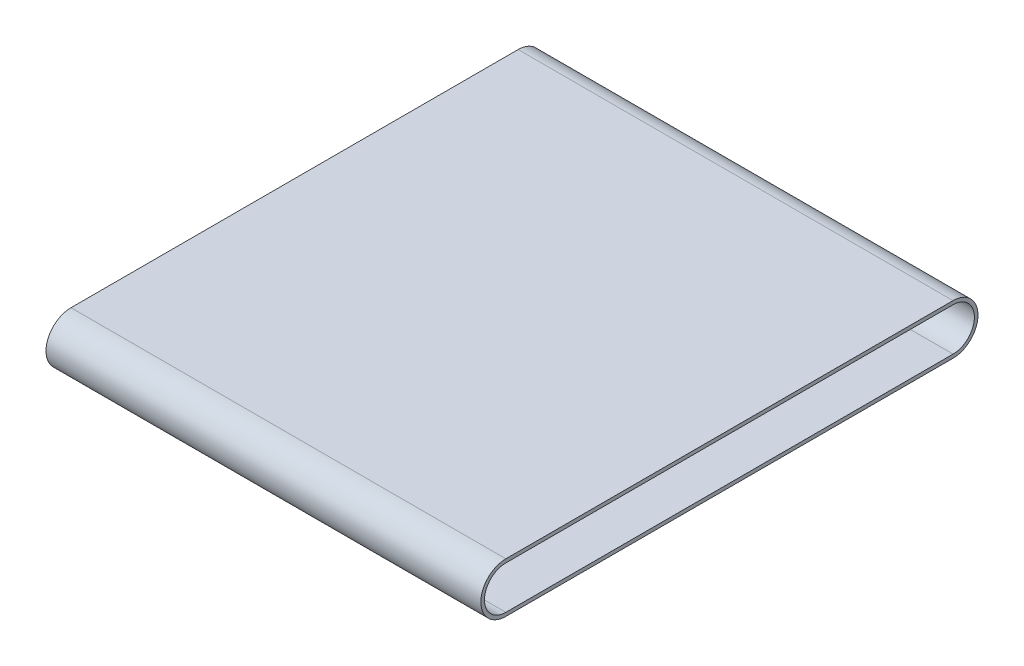
ISO-10303-21;
HEADER;
FILE_DESCRIPTION(('STEP AP214'),'2;1');
FILE_NAME('part.step','',(''),(''),'','','');
FILE_SCHEMA(('AUTOMOTIVE_DESIGN { 1 0 10303 214 1 1 1 1 }'));
ENDSEC;
DATA;
#1=APPLICATION_CONTEXT('core data for automotive mechanical design processes');
#2=APPLICATION_PROTOCOL_DEFINITION('international standard','automotive_design',2000,#1);
#3=PRODUCT_CONTEXT('',#1,'mechanical');
#4=PRODUCT('Part','Part','',(#3));
#5=PRODUCT_RELATED_PRODUCT_CATEGORY('part','',(#4));
#6=PRODUCT_DEFINITION_FORMATION('','',#4);
#7=PRODUCT_DEFINITION_CONTEXT('part definition',#1,'design');
#8=PRODUCT_DEFINITION('design','',#6,#7);
#9=PRODUCT_DEFINITION_SHAPE('','',#8);
#10=(LENGTH_UNIT() NAMED_UNIT(*) SI_UNIT(.MILLI.,.METRE.));
#11=(NAMED_UNIT(*) PLANE_ANGLE_UNIT() SI_UNIT($,.RADIAN.));
#12=(NAMED_UNIT(*) SI_UNIT($,.STERADIAN.) SOLID_ANGLE_UNIT());
#13=UNCERTAINTY_MEASURE_WITH_UNIT(LENGTH_MEASURE(1.E-05),#10,'distance_accuracy_value','');
#14=(GEOMETRIC_REPRESENTATION_CONTEXT(3) GLOBAL_UNCERTAINTY_ASSIGNED_CONTEXT((#13)) GLOBAL_UNIT_ASSIGNED_CONTEXT((#10,
#11,#12)) REPRESENTATION_CONTEXT('',''));
#15=CARTESIAN_POINT('',(0.,0.,0.));
#16=DIRECTION('',(0.,0.,1.));
#17=DIRECTION('',(1.,0.,0.));
#18=AXIS2_PLACEMENT_3D('',#15,#16,#17);
#19=CARTESIAN_POINT('',(444.5,0.,0.));
#20=DIRECTION('',(1.,0.,0.));
#21=DIRECTION('',(0.,0.,-1.));
#22=AXIS2_PLACEMENT_3D('',#19,#20,#21);
#23=PLANE('',#22);
#24=CARTESIAN_POINT('',(444.5,0.,0.));
#25=DIRECTION('',(1.,0.,0.));
#26=DIRECTION('',(0.,0.,-1.));
#27=AXIS2_PLACEMENT_3D('',#24,#25,#26);
#28=CIRCLE('',#27,25.527);
#29=CARTESIAN_POINT('',(444.5,25.527,0.));
#30=VERTEX_POINT('',#29);
#31=CARTESIAN_POINT('',(444.5,-25.527,0.));
#32=VERTEX_POINT('',#31);
#33=EDGE_CURVE('E151',#30,#32,#28,.T.);
#34=ORIENTED_EDGE('',*,*,#33,.T.);
#35=DIRECTION('',(0.,0.,-1.));
#36=VECTOR('',#35,1.);
#37=CARTESIAN_POINT('',(444.5,-25.527,0.));
#38=LINE('',#37,#36);
#39=CARTESIAN_POINT('',(444.5,-25.527,-457.073));
#40=VERTEX_POINT('',#39);
#41=EDGE_CURVE('E155',#32,#40,#38,.T.);
#42=ORIENTED_EDGE('',*,*,#41,.T.);
#43=CARTESIAN_POINT('',(444.5,0.,-457.073));
#44=DIRECTION('',(1.,0.,0.));
#45=DIRECTION('',(0.,0.,-1.));
#46=AXIS2_PLACEMENT_3D('',#43,#44,#45);
#47=CIRCLE('',#46,25.527);
#48=CARTESIAN_POINT('',(444.5,25.527,-457.073));
#49=VERTEX_POINT('',#48);
#50=EDGE_CURVE('E159',#40,#49,#47,.T.);
#51=ORIENTED_EDGE('',*,*,#50,.T.);
#52=DIRECTION('',(0.,0.,1.));
#53=VECTOR('',#52,1.);
#54=CARTESIAN_POINT('',(444.5,25.527,0.));
#55=LINE('',#54,#53);
#56=EDGE_CURVE('E162',#49,#30,#55,.T.);
#57=ORIENTED_EDGE('',*,*,#56,.T.);
#58=EDGE_LOOP('',(#34,#42,#51,#57));
#59=FACE_BOUND('',#58,.T.);
#60=DIRECTION('',(0.,0.,-1.));
#61=VECTOR('',#60,1.);
#62=CARTESIAN_POINT('',(444.5,-21.844,0.));
#63=LINE('',#62,#61);
#64=CARTESIAN_POINT('',(444.5,-21.844,0.));
#65=VERTEX_POINT('',#64);
#66=CARTESIAN_POINT('',(444.5,-21.844,-457.073));
#67=VERTEX_POINT('',#66);
#68=EDGE_CURVE('E111',#65,#67,#63,.T.);
#69=ORIENTED_EDGE('',*,*,#68,.F.);
#70=CARTESIAN_POINT('',(444.5,0.,0.));
#71=DIRECTION('',(1.,0.,0.));
#72=DIRECTION('',(0.,0.,-1.));
#73=AXIS2_PLACEMENT_3D('',#70,#71,#72);
#74=CIRCLE('',#73,21.844);
#75=CARTESIAN_POINT('',(444.5,21.844,0.));
#76=VERTEX_POINT('',#75);
#77=EDGE_CURVE('E102',#76,#65,#74,.T.);
#78=ORIENTED_EDGE('',*,*,#77,.F.);
#79=DIRECTION('',(0.,0.,1.));
#80=VECTOR('',#79,1.);
#81=CARTESIAN_POINT('',(444.5,21.844,0.));
#82=LINE('',#81,#80);
#83=CARTESIAN_POINT('',(444.5,21.844,-457.073));
#84=VERTEX_POINT('',#83);
#85=EDGE_CURVE('E129',#84,#76,#82,.T.);
#86=ORIENTED_EDGE('',*,*,#85,.F.);
#87=CARTESIAN_POINT('',(444.5,0.,-457.073));
#88=DIRECTION('',(1.,0.,0.));
#89=DIRECTION('',(0.,0.,-1.));
#90=AXIS2_PLACEMENT_3D('',#87,#88,#89);
#91=CIRCLE('',#90,21.844);
#92=EDGE_CURVE('E124',#67,#84,#91,.T.);
#93=ORIENTED_EDGE('',*,*,#92,.F.);
#94=EDGE_LOOP('',(#69,#78,#86,#93));
#95=FACE_BOUND('',#94,.T.);
#96=ADVANCED_FACE('F36',(#59,#95),#23,.T.);
#97=CARTESIAN_POINT('',(0.,0.,0.));
#98=DIRECTION('',(1.,0.,0.));
#99=DIRECTION('',(0.,0.,-1.));
#100=AXIS2_PLACEMENT_3D('',#97,#98,#99);
#101=PLANE('',#100);
#102=CARTESIAN_POINT('',(0.,0.,0.));
#103=DIRECTION('',(1.,0.,0.));
#104=DIRECTION('',(0.,0.,-1.));
#105=AXIS2_PLACEMENT_3D('',#102,#103,#104);
#106=CIRCLE('',#105,25.527);
#107=CARTESIAN_POINT('',(0.,25.527,0.));
#108=VERTEX_POINT('',#107);
#109=CARTESIAN_POINT('',(0.,-25.527,0.));
#110=VERTEX_POINT('',#109);
#111=EDGE_CURVE('E120',#108,#110,#106,.T.);
#112=ORIENTED_EDGE('',*,*,#111,.F.);
#113=DIRECTION('',(0.,0.,1.));
#114=VECTOR('',#113,1.);
#115=CARTESIAN_POINT('',(0.,25.527,0.));
#116=LINE('',#115,#114);
#117=CARTESIAN_POINT('',(0.,25.527,-457.073));
#118=VERTEX_POINT('',#117);
#119=EDGE_CURVE('E156',#118,#108,#116,.T.);
#120=ORIENTED_EDGE('',*,*,#119,.F.);
#121=CARTESIAN_POINT('',(0.,0.,-457.073));
#122=DIRECTION('',(1.,0.,0.));
#123=DIRECTION('',(0.,0.,-1.));
#124=AXIS2_PLACEMENT_3D('',#121,#122,#123);
#125=CIRCLE('',#124,25.527);
#126=CARTESIAN_POINT('',(0.,-25.527,-457.073));
#127=VERTEX_POINT('',#126);
#128=EDGE_CURVE('E172',#127,#118,#125,.T.);
#129=ORIENTED_EDGE('',*,*,#128,.F.);
#130=DIRECTION('',(0.,0.,-1.));
#131=VECTOR('',#130,1.);
#132=CARTESIAN_POINT('',(0.,-25.527,0.));
#133=LINE('',#132,#131);
#134=EDGE_CURVE('E169',#110,#127,#133,.T.);
#135=ORIENTED_EDGE('',*,*,#134,.F.);
#136=EDGE_LOOP('',(#112,#120,#129,#135));
#137=FACE_BOUND('',#136,.T.);
#138=CARTESIAN_POINT('',(0.,0.,0.));
#139=DIRECTION('',(1.,0.,0.));
#140=DIRECTION('',(0.,0.,-1.));
#141=AXIS2_PLACEMENT_3D('',#138,#139,#140);
#142=CIRCLE('',#141,21.844);
#143=CARTESIAN_POINT('',(0.,21.844,0.));
#144=VERTEX_POINT('',#143);
#145=CARTESIAN_POINT('',(0.,-21.844,0.));
#146=VERTEX_POINT('',#145);
#147=EDGE_CURVE('E60',#144,#146,#142,.T.);
#148=ORIENTED_EDGE('',*,*,#147,.T.);
#149=DIRECTION('',(0.,0.,-1.));
#150=VECTOR('',#149,1.);
#151=CARTESIAN_POINT('',(0.,-21.844,0.));
#152=LINE('',#151,#150);
#153=CARTESIAN_POINT('',(0.,-21.844,-457.073));
#154=VERTEX_POINT('',#153);
#155=EDGE_CURVE('E118',#146,#154,#152,.T.);
#156=ORIENTED_EDGE('',*,*,#155,.T.);
#157=CARTESIAN_POINT('',(0.,0.,-457.073));
#158=DIRECTION('',(1.,0.,0.));
#159=DIRECTION('',(0.,0.,-1.));
#160=AXIS2_PLACEMENT_3D('',#157,#158,#159);
#161=CIRCLE('',#160,21.844);
#162=CARTESIAN_POINT('',(0.,21.844,-457.073));
#163=VERTEX_POINT('',#162);
#164=EDGE_CURVE('E138',#154,#163,#161,.T.);
#165=ORIENTED_EDGE('',*,*,#164,.T.);
#166=DIRECTION('',(0.,0.,1.));
#167=VECTOR('',#166,1.);
#168=CARTESIAN_POINT('',(0.,21.844,0.));
#169=LINE('',#168,#167);
#170=EDGE_CURVE('E112',#163,#144,#169,.T.);
#171=ORIENTED_EDGE('',*,*,#170,.T.);
#172=EDGE_LOOP('',(#148,#156,#165,#171));
#173=FACE_BOUND('',#172,.T.);
#174=ADVANCED_FACE('F196',(#137,#173),#101,.F.);
#175=CARTESIAN_POINT('',(444.5,0.,0.));
#176=DIRECTION('',(-1.,0.,0.));
#177=DIRECTION('',(0.,0.,1.));
#178=AXIS2_PLACEMENT_3D('',#175,#176,#177);
#179=CYLINDRICAL_SURFACE('',#178,25.527);
#180=ORIENTED_EDGE('',*,*,#111,.T.);
#181=DIRECTION('',(-1.,0.,0.));
#182=VECTOR('',#181,1.);
#183=CARTESIAN_POINT('',(444.5,-25.527,0.));
#184=LINE('',#183,#182);
#185=EDGE_CURVE('E11',#32,#110,#184,.T.);
#186=ORIENTED_EDGE('',*,*,#185,.F.);
#187=ORIENTED_EDGE('',*,*,#33,.F.);
#188=DIRECTION('',(-1.,0.,0.));
#189=VECTOR('',#188,1.);
#190=CARTESIAN_POINT('',(444.5,25.527,0.));
#191=LINE('',#190,#189);
#192=EDGE_CURVE('E165',#30,#108,#191,.T.);
#193=ORIENTED_EDGE('',*,*,#192,.T.);
#194=EDGE_LOOP('',(#180,#186,#187,#193));
#195=FACE_BOUND('',#194,.T.);
#196=ADVANCED_FACE('F38',(#195),#179,.T.);
#197=CARTESIAN_POINT('',(444.5,-25.527,0.));
#198=DIRECTION('',(0.,1.,0.));
#199=DIRECTION('',(0.,0.,1.));
#200=AXIS2_PLACEMENT_3D('',#197,#198,#199);
#201=PLANE('',#200);
#202=ORIENTED_EDGE('',*,*,#134,.T.);
#203=DIRECTION('',(-1.,0.,0.));
#204=VECTOR('',#203,1.);
#205=CARTESIAN_POINT('',(444.5,-25.527,-457.073));
#206=LINE('',#205,#204);
#207=EDGE_CURVE('E45',#40,#127,#206,.T.);
#208=ORIENTED_EDGE('',*,*,#207,.F.);
#209=ORIENTED_EDGE('',*,*,#41,.F.);
#210=ORIENTED_EDGE('',*,*,#185,.T.);
#211=EDGE_LOOP('',(#202,#208,#209,#210));
#212=FACE_BOUND('',#211,.T.);
#213=ADVANCED_FACE('F206',(#212),#201,.F.);
#214=CARTESIAN_POINT('',(444.5,0.,-457.073));
#215=DIRECTION('',(-1.,0.,0.));
#216=DIRECTION('',(0.,0.,1.));
#217=AXIS2_PLACEMENT_3D('',#214,#215,#216);
#218=CYLINDRICAL_SURFACE('',#217,25.527);
#219=ORIENTED_EDGE('',*,*,#128,.T.);
#220=DIRECTION('',(-1.,0.,0.));
#221=VECTOR('',#220,1.);
#222=CARTESIAN_POINT('',(444.5,25.527,-457.073));
#223=LINE('',#222,#221);
#224=EDGE_CURVE('E180',#49,#118,#223,.T.);
#225=ORIENTED_EDGE('',*,*,#224,.F.);
#226=ORIENTED_EDGE('',*,*,#50,.F.);
#227=ORIENTED_EDGE('',*,*,#207,.T.);
#228=EDGE_LOOP('',(#219,#225,#226,#227));
#229=FACE_BOUND('',#228,.T.);
#230=ADVANCED_FACE('F190',(#229),#218,.T.);
#231=CARTESIAN_POINT('',(444.5,25.527,0.));
#232=DIRECTION('',(0.,-1.,0.));
#233=DIRECTION('',(0.,0.,-1.));
#234=AXIS2_PLACEMENT_3D('',#231,#232,#233);
#235=PLANE('',#234);
#236=ORIENTED_EDGE('',*,*,#119,.T.);
#237=ORIENTED_EDGE('',*,*,#192,.F.);
#238=ORIENTED_EDGE('',*,*,#56,.F.);
#239=ORIENTED_EDGE('',*,*,#224,.T.);
#240=EDGE_LOOP('',(#236,#237,#238,#239));
#241=FACE_BOUND('',#240,.T.);
#242=ADVANCED_FACE('F200',(#241),#235,.F.);
#243=CARTESIAN_POINT('',(444.5,0.,0.));
#244=DIRECTION('',(-1.,0.,0.));
#245=DIRECTION('',(0.,0.,1.));
#246=AXIS2_PLACEMENT_3D('',#243,#244,#245);
#247=CYLINDRICAL_SURFACE('',#246,21.844);
#248=ORIENTED_EDGE('',*,*,#147,.F.);
#249=DIRECTION('',(-1.,0.,0.));
#250=VECTOR('',#249,1.);
#251=CARTESIAN_POINT('',(444.5,21.844,0.));
#252=LINE('',#251,#250);
#253=EDGE_CURVE('E106',#76,#144,#252,.T.);
#254=ORIENTED_EDGE('',*,*,#253,.F.);
#255=ORIENTED_EDGE('',*,*,#77,.T.);
#256=DIRECTION('',(-1.,0.,0.));
#257=VECTOR('',#256,1.);
#258=CARTESIAN_POINT('',(444.5,-21.844,0.));
#259=LINE('',#258,#257);
#260=EDGE_CURVE('E105',#65,#146,#259,.T.);
#261=ORIENTED_EDGE('',*,*,#260,.T.);
#262=EDGE_LOOP('',(#248,#254,#255,#261));
#263=FACE_BOUND('',#262,.T.);
#264=ADVANCED_FACE('F104',(#263),#247,.F.);
#265=CARTESIAN_POINT('',(444.5,-21.844,0.));
#266=DIRECTION('',(0.,1.,0.));
#267=DIRECTION('',(0.,0.,1.));
#268=AXIS2_PLACEMENT_3D('',#265,#266,#267);
#269=PLANE('',#268);
#270=ORIENTED_EDGE('',*,*,#155,.F.);
#271=ORIENTED_EDGE('',*,*,#260,.F.);
#272=ORIENTED_EDGE('',*,*,#68,.T.);
#273=DIRECTION('',(-1.,0.,0.));
#274=VECTOR('',#273,1.);
#275=CARTESIAN_POINT('',(444.5,-21.844,-457.073));
#276=LINE('',#275,#274);
#277=EDGE_CURVE('E121',#67,#154,#276,.T.);
#278=ORIENTED_EDGE('',*,*,#277,.T.);
#279=EDGE_LOOP('',(#270,#271,#272,#278));
#280=FACE_BOUND('',#279,.T.);
#281=ADVANCED_FACE('F115',(#280),#269,.T.);
#282=CARTESIAN_POINT('',(444.5,0.,-457.073));
#283=DIRECTION('',(-1.,0.,0.));
#284=DIRECTION('',(0.,0.,1.));
#285=AXIS2_PLACEMENT_3D('',#282,#283,#284);
#286=CYLINDRICAL_SURFACE('',#285,21.844);
#287=ORIENTED_EDGE('',*,*,#164,.F.);
#288=ORIENTED_EDGE('',*,*,#277,.F.);
#289=ORIENTED_EDGE('',*,*,#92,.T.);
#290=DIRECTION('',(-1.,0.,0.));
#291=VECTOR('',#290,1.);
#292=CARTESIAN_POINT('',(444.5,21.844,-457.073));
#293=LINE('',#292,#291);
#294=EDGE_CURVE('E52',#84,#163,#293,.T.);
#295=ORIENTED_EDGE('',*,*,#294,.T.);
#296=EDGE_LOOP('',(#287,#288,#289,#295));
#297=FACE_BOUND('',#296,.T.);
#298=ADVANCED_FACE('F229',(#297),#286,.F.);
#299=CARTESIAN_POINT('',(444.5,21.844,0.));
#300=DIRECTION('',(0.,-1.,0.));
#301=DIRECTION('',(0.,0.,-1.));
#302=AXIS2_PLACEMENT_3D('',#299,#300,#301);
#303=PLANE('',#302);
#304=ORIENTED_EDGE('',*,*,#170,.F.);
#305=ORIENTED_EDGE('',*,*,#294,.F.);
#306=ORIENTED_EDGE('',*,*,#85,.T.);
#307=ORIENTED_EDGE('',*,*,#253,.T.);
#308=EDGE_LOOP('',(#304,#305,#306,#307));
#309=FACE_BOUND('',#308,.T.);
#310=ADVANCED_FACE('F233',(#309),#303,.T.);
#311=CLOSED_SHELL('',(#96,#174,#196,#213,#230,#242,#264,#281,#298,#310));
#312=MANIFOLD_SOLID_BREP('B2',#311);
#313=ADVANCED_BREP_SHAPE_REPRESENTATION('',(#18,#312),#14);
#314=SHAPE_DEFINITION_REPRESENTATION(#9,#313);
ENDSEC;
END-ISO-10303-21;
